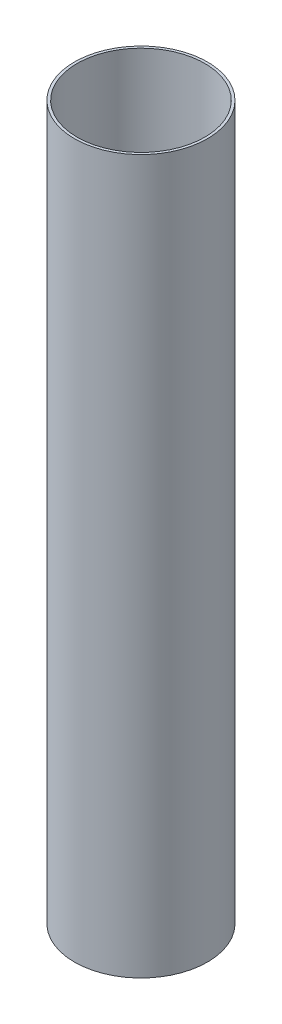
ISO-10303-21;
HEADER;
FILE_DESCRIPTION(('STEP AP214'),'2;1');
FILE_NAME('part.step','',(''),(''),'','','');
FILE_SCHEMA(('AUTOMOTIVE_DESIGN { 1 0 10303 214 1 1 1 1 }'));
ENDSEC;
DATA;
#1=APPLICATION_CONTEXT('core data for automotive mechanical design processes');
#2=APPLICATION_PROTOCOL_DEFINITION('international standard','automotive_design',2000,#1);
#3=PRODUCT_CONTEXT('',#1,'mechanical');
#4=PRODUCT('Part','Part','',(#3));
#5=PRODUCT_RELATED_PRODUCT_CATEGORY('part','',(#4));
#6=PRODUCT_DEFINITION_FORMATION('','',#4);
#7=PRODUCT_DEFINITION_CONTEXT('part definition',#1,'design');
#8=PRODUCT_DEFINITION('design','',#6,#7);
#9=PRODUCT_DEFINITION_SHAPE('','',#8);
#10=(LENGTH_UNIT() NAMED_UNIT(*) SI_UNIT(.MILLI.,.METRE.));
#11=(NAMED_UNIT(*) PLANE_ANGLE_UNIT() SI_UNIT($,.RADIAN.));
#12=(NAMED_UNIT(*) SI_UNIT($,.STERADIAN.) SOLID_ANGLE_UNIT());
#13=UNCERTAINTY_MEASURE_WITH_UNIT(LENGTH_MEASURE(1.E-05),#10,'distance_accuracy_value','');
#14=(GEOMETRIC_REPRESENTATION_CONTEXT(3) GLOBAL_UNCERTAINTY_ASSIGNED_CONTEXT((#13)) GLOBAL_UNIT_ASSIGNED_CONTEXT((#10,
#11,#12)) REPRESENTATION_CONTEXT('',''));
#15=CARTESIAN_POINT('',(0.,0.,0.));
#16=DIRECTION('',(0.,0.,1.));
#17=DIRECTION('',(1.,0.,0.));
#18=AXIS2_PLACEMENT_3D('',#15,#16,#17);
#19=CARTESIAN_POINT('',(0.,305.562,0.));
#20=DIRECTION('',(0.,1.,0.));
#21=DIRECTION('',(0.,0.,1.));
#22=AXIS2_PLACEMENT_3D('',#19,#20,#21);
#23=PLANE('',#22);
#24=CARTESIAN_POINT('',(0.,305.562,0.));
#25=DIRECTION('',(0.,1.,0.));
#26=DIRECTION('',(0.,0.,1.));
#27=AXIS2_PLACEMENT_3D('',#24,#25,#26);
#28=CIRCLE('',#27,28.4988);
#29=CARTESIAN_POINT('',(0.,305.562,28.4988));
#30=VERTEX_POINT('',#29);
#31=EDGE_CURVE('E10',#30,#30,#28,.T.);
#32=ORIENTED_EDGE('',*,*,#31,.T.);
#33=EDGE_LOOP('',(#32));
#34=FACE_BOUND('',#33,.T.);
#35=CARTESIAN_POINT('',(0.,305.562,0.));
#36=DIRECTION('',(0.,1.,0.));
#37=DIRECTION('',(0.,0.,1.));
#38=AXIS2_PLACEMENT_3D('',#35,#36,#37);
#39=CIRCLE('',#38,27.3812);
#40=CARTESIAN_POINT('',(0.,305.562,27.3812));
#41=VERTEX_POINT('',#40);
#42=EDGE_CURVE('E44',#41,#41,#39,.T.);
#43=ORIENTED_EDGE('',*,*,#42,.F.);
#44=EDGE_LOOP('',(#43));
#45=FACE_BOUND('',#44,.T.);
#46=ADVANCED_FACE('F33',(#34,#45),#23,.T.);
#47=CARTESIAN_POINT('',(0.,0.,0.));
#48=DIRECTION('',(0.,1.,0.));
#49=DIRECTION('',(0.,0.,1.));
#50=AXIS2_PLACEMENT_3D('',#47,#48,#49);
#51=PLANE('',#50);
#52=CARTESIAN_POINT('',(0.,0.,0.));
#53=DIRECTION('',(0.,1.,0.));
#54=DIRECTION('',(0.,0.,1.));
#55=AXIS2_PLACEMENT_3D('',#52,#53,#54);
#56=CIRCLE('',#55,28.4988);
#57=CARTESIAN_POINT('',(0.,0.,28.4988));
#58=VERTEX_POINT('',#57);
#59=EDGE_CURVE('E37',#58,#58,#56,.T.);
#60=ORIENTED_EDGE('',*,*,#59,.F.);
#61=EDGE_LOOP('',(#60));
#62=FACE_BOUND('',#61,.T.);
#63=CARTESIAN_POINT('',(0.,0.,0.));
#64=DIRECTION('',(0.,1.,0.));
#65=DIRECTION('',(0.,0.,1.));
#66=AXIS2_PLACEMENT_3D('',#63,#64,#65);
#67=CIRCLE('',#66,27.3812);
#68=CARTESIAN_POINT('',(0.,0.,27.3812));
#69=VERTEX_POINT('',#68);
#70=EDGE_CURVE('E46',#69,#69,#67,.T.);
#71=ORIENTED_EDGE('',*,*,#70,.T.);
#72=EDGE_LOOP('',(#71));
#73=FACE_BOUND('',#72,.T.);
#74=ADVANCED_FACE('F56',(#62,#73),#51,.F.);
#75=CARTESIAN_POINT('',(0.,305.562,0.));
#76=DIRECTION('',(0.,-1.,0.));
#77=DIRECTION('',(0.,0.,-1.));
#78=AXIS2_PLACEMENT_3D('',#75,#76,#77);
#79=CYLINDRICAL_SURFACE('',#78,28.4988);
#80=ORIENTED_EDGE('',*,*,#31,.F.);
#81=EDGE_LOOP('',(#80));
#82=FACE_BOUND('',#81,.T.);
#83=ORIENTED_EDGE('',*,*,#59,.T.);
#84=EDGE_LOOP('',(#83));
#85=FACE_BOUND('',#84,.T.);
#86=ADVANCED_FACE('F35',(#82,#85),#79,.T.);
#87=CARTESIAN_POINT('',(0.,305.562,0.));
#88=DIRECTION('',(0.,-1.,0.));
#89=DIRECTION('',(0.,0.,-1.));
#90=AXIS2_PLACEMENT_3D('',#87,#88,#89);
#91=CYLINDRICAL_SURFACE('',#90,27.3812);
#92=ORIENTED_EDGE('',*,*,#42,.T.);
#93=EDGE_LOOP('',(#92));
#94=FACE_BOUND('',#93,.T.);
#95=ORIENTED_EDGE('',*,*,#70,.F.);
#96=EDGE_LOOP('',(#95));
#97=FACE_BOUND('',#96,.T.);
#98=ADVANCED_FACE('F52',(#94,#97),#91,.F.);
#99=CLOSED_SHELL('',(#46,#74,#86,#98));
#100=MANIFOLD_SOLID_BREP('B2',#99);
#101=ADVANCED_BREP_SHAPE_REPRESENTATION('',(#18,#100),#14);
#102=SHAPE_DEFINITION_REPRESENTATION(#9,#101);
ENDSEC;
END-ISO-10303-21;
